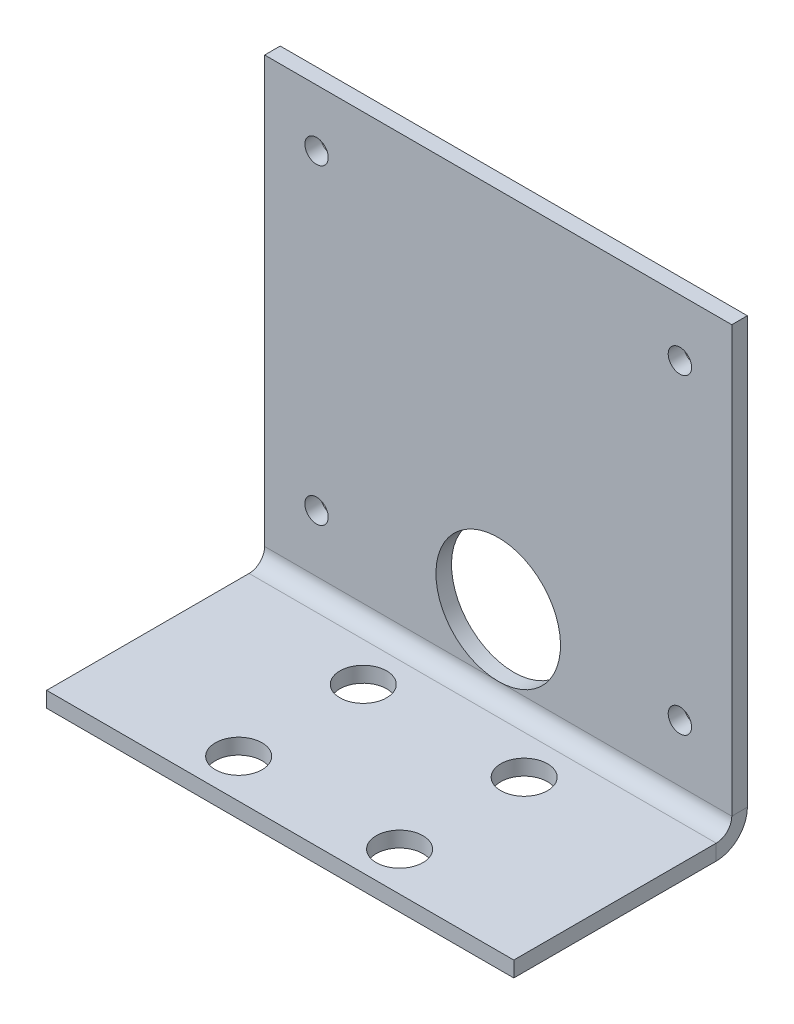
ISO-10303-21;
HEADER;
FILE_DESCRIPTION(('STEP AP214'),'2;1');
FILE_NAME('part.step','',(''),(''),'','','');
FILE_SCHEMA(('AUTOMOTIVE_DESIGN { 1 0 10303 214 1 1 1 1 }'));
ENDSEC;
DATA;
#1=APPLICATION_CONTEXT('core data for automotive mechanical design processes');
#2=APPLICATION_PROTOCOL_DEFINITION('international standard','automotive_design',2000,#1);
#3=PRODUCT_CONTEXT('',#1,'mechanical');
#4=PRODUCT('Part','Part','',(#3));
#5=PRODUCT_RELATED_PRODUCT_CATEGORY('part','',(#4));
#6=PRODUCT_DEFINITION_FORMATION('','',#4);
#7=PRODUCT_DEFINITION_CONTEXT('part definition',#1,'design');
#8=PRODUCT_DEFINITION('design','',#6,#7);
#9=PRODUCT_DEFINITION_SHAPE('','',#8);
#10=(LENGTH_UNIT() NAMED_UNIT(*) SI_UNIT(.MILLI.,.METRE.));
#11=(NAMED_UNIT(*) PLANE_ANGLE_UNIT() SI_UNIT($,.RADIAN.));
#12=(NAMED_UNIT(*) SI_UNIT($,.STERADIAN.) SOLID_ANGLE_UNIT());
#13=UNCERTAINTY_MEASURE_WITH_UNIT(LENGTH_MEASURE(1.E-05),#10,'distance_accuracy_value','');
#14=(GEOMETRIC_REPRESENTATION_CONTEXT(3) GLOBAL_UNCERTAINTY_ASSIGNED_CONTEXT((#13)) GLOBAL_UNIT_ASSIGNED_CONTEXT((#10,
#11,#12)) REPRESENTATION_CONTEXT('',''));
#15=CARTESIAN_POINT('',(0.,0.,0.));
#16=DIRECTION('',(0.,0.,1.));
#17=DIRECTION('',(1.,0.,0.));
#18=AXIS2_PLACEMENT_3D('',#15,#16,#17);
#19=CARTESIAN_POINT('',(-90.,-3.,-100.));
#20=DIRECTION('',(-1.,0.,0.));
#21=DIRECTION('',(0.,0.,1.));
#22=AXIS2_PLACEMENT_3D('',#19,#20,#21);
#23=PLANE('',#22);
#24=DIRECTION('',(0.,1.,0.));
#25=VECTOR('',#24,1.);
#26=CARTESIAN_POINT('',(-90.,-10.,-58.));
#27=LINE('',#26,#25);
#28=CARTESIAN_POINT('',(-90.,-3.,-58.));
#29=VERTEX_POINT('',#28);
#30=CARTESIAN_POINT('',(-90.,0.,-58.));
#31=VERTEX_POINT('',#30);
#32=EDGE_CURVE('E224',#29,#31,#27,.T.);
#33=ORIENTED_EDGE('',*,*,#32,.T.);
#34=DIRECTION('',(0.,0.,1.));
#35=VECTOR('',#34,1.);
#36=CARTESIAN_POINT('',(-90.,0.,-100.));
#37=LINE('',#36,#35);
#38=CARTESIAN_POINT('',(-90.,0.,-97.));
#39=VERTEX_POINT('',#38);
#40=EDGE_CURVE('E164',#39,#31,#37,.T.);
#41=ORIENTED_EDGE('',*,*,#40,.F.);
#42=DIRECTION('',(0.,-1.,0.));
#43=VECTOR('',#42,1.);
#44=CARTESIAN_POINT('',(-90.,0.,-97.));
#45=LINE('',#44,#43);
#46=CARTESIAN_POINT('',(-90.,-3.00000000000003,-97.));
#47=VERTEX_POINT('',#46);
#48=EDGE_CURVE('E149',#39,#47,#45,.T.);
#49=ORIENTED_EDGE('',*,*,#48,.T.);
#50=DIRECTION('',(0.,0.,1.));
#51=VECTOR('',#50,1.);
#52=CARTESIAN_POINT('',(-90.,-3.,-100.));
#53=LINE('',#52,#51);
#54=EDGE_CURVE('E48',#47,#29,#53,.T.);
#55=ORIENTED_EDGE('',*,*,#54,.T.);
#56=EDGE_LOOP('',(#33,#41,#49,#55));
#57=FACE_BOUND('',#56,.T.);
#58=ADVANCED_FACE('F40',(#57),#23,.T.);
#59=CARTESIAN_POINT('',(0.,-3.,0.));
#60=DIRECTION('',(0.,1.,0.));
#61=DIRECTION('',(0.,0.,1.));
#62=AXIS2_PLACEMENT_3D('',#59,#60,#61);
#63=PLANE('',#62);
#64=CARTESIAN_POINT('',(-29.4999999999998,-3.,-89.5000000000001));
#65=DIRECTION('',(0.,-1.,0.));
#66=DIRECTION('',(0.,0.,-1.));
#67=AXIS2_PLACEMENT_3D('',#64,#65,#66);
#68=CIRCLE('',#67,4.5);
#69=CARTESIAN_POINT('',(-29.4999999999998,-3.,-94.0000000000001));
#70=VERTEX_POINT('',#69);
#71=EDGE_CURVE('E240',#70,#70,#68,.T.);
#72=ORIENTED_EDGE('',*,*,#71,.F.);
#73=EDGE_LOOP('',(#72));
#74=FACE_BOUND('',#73,.T.);
#75=CARTESIAN_POINT('',(-29.4999999999999,-3.,-65.5000000000001));
#76=DIRECTION('',(0.,-1.,0.));
#77=DIRECTION('',(0.,0.,-1.));
#78=AXIS2_PLACEMENT_3D('',#75,#76,#77);
#79=CIRCLE('',#78,4.5);
#80=CARTESIAN_POINT('',(-29.4999999999999,-3.,-70.0000000000001));
#81=VERTEX_POINT('',#80);
#82=EDGE_CURVE('E244',#81,#81,#79,.T.);
#83=ORIENTED_EDGE('',*,*,#82,.F.);
#84=EDGE_LOOP('',(#83));
#85=FACE_BOUND('',#84,.T.);
#86=CARTESIAN_POINT('',(-60.4999999999999,-3.,-65.5));
#87=DIRECTION('',(0.,-1.,0.));
#88=DIRECTION('',(0.,0.,-1.));
#89=AXIS2_PLACEMENT_3D('',#86,#87,#88);
#90=CIRCLE('',#89,4.5);
#91=CARTESIAN_POINT('',(-60.4999999999999,-3.,-70.));
#92=VERTEX_POINT('',#91);
#93=EDGE_CURVE('E241',#92,#92,#90,.T.);
#94=ORIENTED_EDGE('',*,*,#93,.F.);
#95=EDGE_LOOP('',(#94));
#96=FACE_BOUND('',#95,.T.);
#97=CARTESIAN_POINT('',(-60.4999999999999,-3.,-89.5));
#98=DIRECTION('',(0.,-1.,0.));
#99=DIRECTION('',(0.,0.,-1.));
#100=AXIS2_PLACEMENT_3D('',#97,#98,#99);
#101=CIRCLE('',#100,4.5);
#102=CARTESIAN_POINT('',(-60.4999999999999,-3.,-94.));
#103=VERTEX_POINT('',#102);
#104=EDGE_CURVE('E177',#103,#103,#101,.T.);
#105=ORIENTED_EDGE('',*,*,#104,.F.);
#106=EDGE_LOOP('',(#105));
#107=FACE_BOUND('',#106,.T.);
#108=DIRECTION('',(0.,0.,-1.));
#109=VECTOR('',#108,1.);
#110=CARTESIAN_POINT('',(0.,-3.,-100.));
#111=LINE('',#110,#109);
#112=CARTESIAN_POINT('',(0.,-3.,-58.));
#113=VERTEX_POINT('',#112);
#114=CARTESIAN_POINT('',(0.,-3.,-97.));
#115=VERTEX_POINT('',#114);
#116=EDGE_CURVE('E11',#113,#115,#111,.T.);
#117=ORIENTED_EDGE('',*,*,#116,.F.);
#118=DIRECTION('',(-1.,0.,0.));
#119=VECTOR('',#118,1.);
#120=CARTESIAN_POINT('',(0.,-3.,-58.));
#121=LINE('',#120,#119);
#122=EDGE_CURVE('E64',#113,#29,#121,.T.);
#123=ORIENTED_EDGE('',*,*,#122,.T.);
#124=ORIENTED_EDGE('',*,*,#54,.F.);
#125=DIRECTION('',(-1.,0.,0.));
#126=VECTOR('',#125,1.);
#127=CARTESIAN_POINT('',(-90.,-3.00000000000003,-97.));
#128=LINE('',#127,#126);
#129=EDGE_CURVE('E142',#47,#115,#128,.F.);
#130=ORIENTED_EDGE('',*,*,#129,.T.);
#131=EDGE_LOOP('',(#117,#123,#124,#130));
#132=FACE_BOUND('',#131,.T.);
#133=ADVANCED_FACE('F230',(#74,#85,#96,#107,#132),#63,.F.);
#134=CARTESIAN_POINT('',(0.,0.,0.));
#135=DIRECTION('',(0.,1.,0.));
#136=DIRECTION('',(0.,0.,1.));
#137=AXIS2_PLACEMENT_3D('',#134,#135,#136);
#138=PLANE('',#137);
#139=DIRECTION('',(-1.,0.,0.));
#140=VECTOR('',#139,1.);
#141=CARTESIAN_POINT('',(-90.,0.,-58.));
#142=LINE('',#141,#140);
#143=CARTESIAN_POINT('',(0.,0.,-58.));
#144=VERTEX_POINT('',#143);
#145=EDGE_CURVE('E454',#144,#31,#142,.T.);
#146=ORIENTED_EDGE('',*,*,#145,.F.);
#147=DIRECTION('',(0.,0.,-1.));
#148=VECTOR('',#147,1.);
#149=CARTESIAN_POINT('',(0.,0.,-100.));
#150=LINE('',#149,#148);
#151=CARTESIAN_POINT('',(0.,0.,-97.));
#152=VERTEX_POINT('',#151);
#153=EDGE_CURVE('E168',#144,#152,#150,.T.);
#154=ORIENTED_EDGE('',*,*,#153,.T.);
#155=DIRECTION('',(-1.,0.,0.));
#156=VECTOR('',#155,1.);
#157=CARTESIAN_POINT('',(-90.,0.,-97.));
#158=LINE('',#157,#156);
#159=EDGE_CURVE('E155',#39,#152,#158,.F.);
#160=ORIENTED_EDGE('',*,*,#159,.F.);
#161=ORIENTED_EDGE('',*,*,#40,.T.);
#162=EDGE_LOOP('',(#146,#154,#160,#161));
#163=FACE_BOUND('',#162,.T.);
#164=CARTESIAN_POINT('',(-29.4999999999998,0.,-89.5000000000001));
#165=DIRECTION('',(0.,1.,0.));
#166=DIRECTION('',(0.,0.,1.));
#167=AXIS2_PLACEMENT_3D('',#164,#165,#166);
#168=CIRCLE('',#167,4.5);
#169=CARTESIAN_POINT('',(-29.4999999999998,0.,-85.0000000000001));
#170=VERTEX_POINT('',#169);
#171=EDGE_CURVE('E43',#170,#170,#168,.T.);
#172=ORIENTED_EDGE('',*,*,#171,.F.);
#173=EDGE_LOOP('',(#172));
#174=FACE_BOUND('',#173,.T.);
#175=CARTESIAN_POINT('',(-29.4999999999999,0.,-65.5000000000001));
#176=DIRECTION('',(0.,1.,0.));
#177=DIRECTION('',(0.,0.,1.));
#178=AXIS2_PLACEMENT_3D('',#175,#176,#177);
#179=CIRCLE('',#178,4.5);
#180=CARTESIAN_POINT('',(-29.4999999999999,0.,-61.0000000000001));
#181=VERTEX_POINT('',#180);
#182=EDGE_CURVE('E179',#181,#181,#179,.T.);
#183=ORIENTED_EDGE('',*,*,#182,.F.);
#184=EDGE_LOOP('',(#183));
#185=FACE_BOUND('',#184,.T.);
#186=CARTESIAN_POINT('',(-60.4999999999999,0.,-65.5));
#187=DIRECTION('',(0.,1.,0.));
#188=DIRECTION('',(0.,0.,1.));
#189=AXIS2_PLACEMENT_3D('',#186,#187,#188);
#190=CIRCLE('',#189,4.5);
#191=CARTESIAN_POINT('',(-60.4999999999999,0.,-61.));
#192=VERTEX_POINT('',#191);
#193=EDGE_CURVE('E176',#192,#192,#190,.T.);
#194=ORIENTED_EDGE('',*,*,#193,.F.);
#195=EDGE_LOOP('',(#194));
#196=FACE_BOUND('',#195,.T.);
#197=CARTESIAN_POINT('',(-60.4999999999999,0.,-89.5));
#198=DIRECTION('',(0.,1.,0.));
#199=DIRECTION('',(0.,0.,1.));
#200=AXIS2_PLACEMENT_3D('',#197,#198,#199);
#201=CIRCLE('',#200,4.5);
#202=CARTESIAN_POINT('',(-60.4999999999999,0.,-85.));
#203=VERTEX_POINT('',#202);
#204=EDGE_CURVE('E173',#203,#203,#201,.T.);
#205=ORIENTED_EDGE('',*,*,#204,.F.);
#206=EDGE_LOOP('',(#205));
#207=FACE_BOUND('',#206,.T.);
#208=ADVANCED_FACE('F219',(#163,#174,#185,#196,#207),#138,.T.);
#209=CARTESIAN_POINT('',(0.,-3.,-100.));
#210=DIRECTION('',(1.,0.,0.));
#211=DIRECTION('',(0.,0.,-1.));
#212=AXIS2_PLACEMENT_3D('',#209,#210,#211);
#213=PLANE('',#212);
#214=DIRECTION('',(0.,1.,0.));
#215=VECTOR('',#214,1.);
#216=CARTESIAN_POINT('',(0.,-10.,-58.));
#217=LINE('',#216,#215);
#218=EDGE_CURVE('E235',#113,#144,#217,.T.);
#219=ORIENTED_EDGE('',*,*,#218,.F.);
#220=ORIENTED_EDGE('',*,*,#116,.T.);
#221=DIRECTION('',(0.,-1.,0.));
#222=VECTOR('',#221,1.);
#223=CARTESIAN_POINT('',(0.,0.,-97.));
#224=LINE('',#223,#222);
#225=EDGE_CURVE('E161',#152,#115,#224,.T.);
#226=ORIENTED_EDGE('',*,*,#225,.F.);
#227=ORIENTED_EDGE('',*,*,#153,.F.);
#228=EDGE_LOOP('',(#219,#220,#226,#227));
#229=FACE_BOUND('',#228,.T.);
#230=ADVANCED_FACE('F211',(#229),#213,.T.);
#231=CARTESIAN_POINT('',(0.,2.99999999999997,-97.));
#232=DIRECTION('',(1.,0.,0.));
#233=DIRECTION('',(0.,0.,-1.));
#234=AXIS2_PLACEMENT_3D('',#231,#232,#233);
#235=PLANE('',#234);
#236=DIRECTION('',(0.,0.,-1.));
#237=VECTOR('',#236,1.);
#238=CARTESIAN_POINT('',(0.,2.99999999999999,-100.));
#239=LINE('',#238,#237);
#240=CARTESIAN_POINT('',(0.,2.99999999999996,-100.));
#241=VERTEX_POINT('',#240);
#242=CARTESIAN_POINT('',(0.,2.99999999999995,-103.));
#243=VERTEX_POINT('',#242);
#244=EDGE_CURVE('E184',#241,#243,#239,.T.);
#245=ORIENTED_EDGE('',*,*,#244,.F.);
#246=CARTESIAN_POINT('',(0.,2.99999999999997,-97.));
#247=DIRECTION('',(-1.,0.,0.));
#248=DIRECTION('',(0.,0.,1.));
#249=AXIS2_PLACEMENT_3D('',#246,#247,#248);
#250=CIRCLE('',#249,3.);
#251=EDGE_CURVE('E152',#152,#241,#250,.F.);
#252=ORIENTED_EDGE('',*,*,#251,.F.);
#253=ORIENTED_EDGE('',*,*,#225,.T.);
#254=CARTESIAN_POINT('',(0.,2.99999999999997,-97.));
#255=DIRECTION('',(-1.,0.,0.));
#256=DIRECTION('',(0.,0.,1.));
#257=AXIS2_PLACEMENT_3D('',#254,#255,#256);
#258=CIRCLE('',#257,6.);
#259=EDGE_CURVE('E145',#115,#243,#258,.F.);
#260=ORIENTED_EDGE('',*,*,#259,.T.);
#261=EDGE_LOOP('',(#245,#252,#253,#260));
#262=FACE_BOUND('',#261,.T.);
#263=ADVANCED_FACE('F206',(#262),#235,.T.);
#264=CARTESIAN_POINT('',(-90.,2.99999999999997,-97.));
#265=DIRECTION('',(1.,0.,0.));
#266=DIRECTION('',(0.,0.,-1.));
#267=AXIS2_PLACEMENT_3D('',#264,#265,#266);
#268=PLANE('',#267);
#269=CARTESIAN_POINT('',(-90.,2.99999999999997,-97.));
#270=DIRECTION('',(-1.,0.,0.));
#271=DIRECTION('',(0.,0.,1.));
#272=AXIS2_PLACEMENT_3D('',#269,#270,#271);
#273=CIRCLE('',#272,3.);
#274=CARTESIAN_POINT('',(-90.,2.99999999999996,-100.));
#275=VERTEX_POINT('',#274);
#276=EDGE_CURVE('E158',#275,#39,#273,.T.);
#277=ORIENTED_EDGE('',*,*,#276,.F.);
#278=DIRECTION('',(0.,0.,-1.));
#279=VECTOR('',#278,1.);
#280=CARTESIAN_POINT('',(-90.,2.99999999999999,-100.));
#281=LINE('',#280,#279);
#282=CARTESIAN_POINT('',(-90.,3.00000000000001,-103.));
#283=VERTEX_POINT('',#282);
#284=EDGE_CURVE('E192',#275,#283,#281,.T.);
#285=ORIENTED_EDGE('',*,*,#284,.T.);
#286=CARTESIAN_POINT('',(-90.,2.99999999999997,-97.));
#287=DIRECTION('',(-1.,0.,0.));
#288=DIRECTION('',(0.,0.,1.));
#289=AXIS2_PLACEMENT_3D('',#286,#287,#288);
#290=CIRCLE('',#289,6.);
#291=EDGE_CURVE('E146',#283,#47,#290,.T.);
#292=ORIENTED_EDGE('',*,*,#291,.T.);
#293=ORIENTED_EDGE('',*,*,#48,.F.);
#294=EDGE_LOOP('',(#277,#285,#292,#293));
#295=FACE_BOUND('',#294,.T.);
#296=ADVANCED_FACE('F226',(#295),#268,.F.);
#297=CARTESIAN_POINT('',(-90.,2.99999999999997,-97.));
#298=DIRECTION('',(-1.,0.,0.));
#299=DIRECTION('',(0.,0.,-1.));
#300=AXIS2_PLACEMENT_3D('',#297,#298,#299);
#301=CYLINDRICAL_SURFACE('',#300,6.);
#302=ORIENTED_EDGE('',*,*,#129,.F.);
#303=ORIENTED_EDGE('',*,*,#291,.F.);
#304=DIRECTION('',(1.,0.,0.));
#305=VECTOR('',#304,1.);
#306=CARTESIAN_POINT('',(0.,3.00000000000001,-103.));
#307=LINE('',#306,#305);
#308=CARTESIAN_POINT('',(-44.9999999999999,3.00000000000001,-103.));
#309=VERTEX_POINT('',#308);
#310=EDGE_CURVE('E138',#283,#309,#307,.T.);
#311=ORIENTED_EDGE('',*,*,#310,.T.);
#312=EDGE_CURVE('E194',#309,#243,#307,.T.);
#313=ORIENTED_EDGE('',*,*,#312,.T.);
#314=ORIENTED_EDGE('',*,*,#259,.F.);
#315=EDGE_LOOP('',(#302,#303,#311,#313,#314));
#316=FACE_BOUND('',#315,.T.);
#317=ADVANCED_FACE('F203',(#316),#301,.T.);
#318=CARTESIAN_POINT('',(-90.,2.99999999999997,-97.));
#319=DIRECTION('',(-1.,0.,0.));
#320=DIRECTION('',(0.,0.,-1.));
#321=AXIS2_PLACEMENT_3D('',#318,#319,#320);
#322=CYLINDRICAL_SURFACE('',#321,3.);
#323=ORIENTED_EDGE('',*,*,#159,.T.);
#324=ORIENTED_EDGE('',*,*,#251,.T.);
#325=DIRECTION('',(-1.,0.,0.));
#326=VECTOR('',#325,1.);
#327=CARTESIAN_POINT('',(0.,2.99999999999999,-100.));
#328=LINE('',#327,#326);
#329=CARTESIAN_POINT('',(-44.9999999999999,2.99999999999999,-100.));
#330=VERTEX_POINT('',#329);
#331=EDGE_CURVE('E132',#241,#330,#328,.T.);
#332=ORIENTED_EDGE('',*,*,#331,.T.);
#333=EDGE_CURVE('E187',#330,#275,#328,.T.);
#334=ORIENTED_EDGE('',*,*,#333,.T.);
#335=ORIENTED_EDGE('',*,*,#276,.T.);
#336=EDGE_LOOP('',(#323,#324,#332,#334,#335));
#337=FACE_BOUND('',#336,.T.);
#338=ADVANCED_FACE('F214',(#337),#322,.F.);
#339=CARTESIAN_POINT('',(-90.,100.,-103.));
#340=DIRECTION('',(1.,0.,0.));
#341=DIRECTION('',(0.,1.,0.));
#342=AXIS2_PLACEMENT_3D('',#339,#340,#341);
#343=PLANE('',#342);
#344=DIRECTION('',(0.,1.,0.));
#345=VECTOR('',#344,1.);
#346=CARTESIAN_POINT('',(-90.,100.,-100.));
#347=LINE('',#346,#345);
#348=CARTESIAN_POINT('',(-90.,85.,-100.));
#349=VERTEX_POINT('',#348);
#350=EDGE_CURVE('E134',#275,#349,#347,.T.);
#351=ORIENTED_EDGE('',*,*,#350,.T.);
#352=DIRECTION('',(0.,0.,1.));
#353=VECTOR('',#352,1.);
#354=CARTESIAN_POINT('',(-90.,85.,-110.));
#355=LINE('',#354,#353);
#356=CARTESIAN_POINT('',(-90.,85.,-103.));
#357=VERTEX_POINT('',#356);
#358=EDGE_CURVE('E56',#357,#349,#355,.T.);
#359=ORIENTED_EDGE('',*,*,#358,.F.);
#360=DIRECTION('',(0.,1.,0.));
#361=VECTOR('',#360,1.);
#362=CARTESIAN_POINT('',(-90.,100.,-103.));
#363=LINE('',#362,#361);
#364=EDGE_CURVE('E133',#283,#357,#363,.T.);
#365=ORIENTED_EDGE('',*,*,#364,.F.);
#366=ORIENTED_EDGE('',*,*,#284,.F.);
#367=EDGE_LOOP('',(#351,#359,#365,#366));
#368=FACE_BOUND('',#367,.T.);
#369=ADVANCED_FACE('F252',(#368),#343,.F.);
#370=CARTESIAN_POINT('',(0.,0.,-103.));
#371=DIRECTION('',(-1.,0.,0.));
#372=DIRECTION('',(0.,-1.,0.));
#373=AXIS2_PLACEMENT_3D('',#370,#371,#372);
#374=PLANE('',#373);
#375=DIRECTION('',(0.,-1.,0.));
#376=VECTOR('',#375,1.);
#377=CARTESIAN_POINT('',(0.,0.,-103.));
#378=LINE('',#377,#376);
#379=CARTESIAN_POINT('',(0.,85.,-103.));
#380=VERTEX_POINT('',#379);
#381=EDGE_CURVE('E125',#380,#243,#378,.T.);
#382=ORIENTED_EDGE('',*,*,#381,.F.);
#383=DIRECTION('',(0.,0.,1.));
#384=VECTOR('',#383,1.);
#385=CARTESIAN_POINT('',(0.,85.,-110.));
#386=LINE('',#385,#384);
#387=CARTESIAN_POINT('',(0.,85.,-100.));
#388=VERTEX_POINT('',#387);
#389=EDGE_CURVE('E111',#380,#388,#386,.T.);
#390=ORIENTED_EDGE('',*,*,#389,.T.);
#391=DIRECTION('',(0.,-1.,0.));
#392=VECTOR('',#391,1.);
#393=CARTESIAN_POINT('',(0.,0.,-100.));
#394=LINE('',#393,#392);
#395=EDGE_CURVE('E123',#388,#241,#394,.T.);
#396=ORIENTED_EDGE('',*,*,#395,.T.);
#397=ORIENTED_EDGE('',*,*,#244,.T.);
#398=EDGE_LOOP('',(#382,#390,#396,#397));
#399=FACE_BOUND('',#398,.T.);
#400=ADVANCED_FACE('F121',(#399),#374,.F.);
#401=CARTESIAN_POINT('',(0.,-3.57419139211891E-13,-103.));
#402=DIRECTION('',(0.,0.,1.));
#403=DIRECTION('',(0.,-1.,0.));
#404=AXIS2_PLACEMENT_3D('',#401,#402,#403);
#405=PLANE('',#404);
#406=CARTESIAN_POINT('',(-80.,74.,-103.));
#407=DIRECTION('',(0.,0.,1.));
#408=DIRECTION('',(0.,-1.,0.));
#409=AXIS2_PLACEMENT_3D('',#406,#407,#408);
#410=CIRCLE('',#409,2.25);
#411=CARTESIAN_POINT('',(-80.,71.75,-103.));
#412=VERTEX_POINT('',#411);
#413=EDGE_CURVE('E431',#412,#412,#410,.T.);
#414=ORIENTED_EDGE('',*,*,#413,.T.);
#415=EDGE_LOOP('',(#414));
#416=FACE_BOUND('',#415,.T.);
#417=CARTESIAN_POINT('',(-9.99999999999995,14.,-103.));
#418=DIRECTION('',(0.,0.,1.));
#419=DIRECTION('',(0.,-1.,0.));
#420=AXIS2_PLACEMENT_3D('',#417,#418,#419);
#421=CIRCLE('',#420,2.25);
#422=CARTESIAN_POINT('',(-9.99999999999995,11.75,-103.));
#423=VERTEX_POINT('',#422);
#424=EDGE_CURVE('E435',#423,#423,#421,.T.);
#425=ORIENTED_EDGE('',*,*,#424,.T.);
#426=EDGE_LOOP('',(#425));
#427=FACE_BOUND('',#426,.T.);
#428=CARTESIAN_POINT('',(-80.,14.,-103.));
#429=DIRECTION('',(0.,0.,1.));
#430=DIRECTION('',(0.,-1.,0.));
#431=AXIS2_PLACEMENT_3D('',#428,#429,#430);
#432=CIRCLE('',#431,2.25);
#433=CARTESIAN_POINT('',(-80.,11.75,-103.));
#434=VERTEX_POINT('',#433);
#435=EDGE_CURVE('E444',#434,#434,#432,.T.);
#436=ORIENTED_EDGE('',*,*,#435,.T.);
#437=EDGE_LOOP('',(#436));
#438=FACE_BOUND('',#437,.T.);
#439=CARTESIAN_POINT('',(-9.99999999999997,74.,-103.));
#440=DIRECTION('',(0.,0.,1.));
#441=DIRECTION('',(0.,-1.,0.));
#442=AXIS2_PLACEMENT_3D('',#439,#440,#441);
#443=CIRCLE('',#442,2.25);
#444=CARTESIAN_POINT('',(-9.99999999999997,71.75,-103.));
#445=VERTEX_POINT('',#444);
#446=EDGE_CURVE('E117',#445,#445,#443,.T.);
#447=ORIENTED_EDGE('',*,*,#446,.T.);
#448=EDGE_LOOP('',(#447));
#449=FACE_BOUND('',#448,.T.);
#450=ORIENTED_EDGE('',*,*,#364,.T.);
#451=DIRECTION('',(1.,0.,0.));
#452=VECTOR('',#451,1.);
#453=CARTESIAN_POINT('',(0.,85.,-103.));
#454=LINE('',#453,#452);
#455=EDGE_CURVE('E126',#357,#380,#454,.T.);
#456=ORIENTED_EDGE('',*,*,#455,.T.);
#457=ORIENTED_EDGE('',*,*,#381,.T.);
#458=ORIENTED_EDGE('',*,*,#312,.F.);
#459=CARTESIAN_POINT('',(-44.9999999999999,15.0000000000001,-103.));
#460=DIRECTION('',(0.,0.,1.));
#461=DIRECTION('',(0.,-1.,0.));
#462=AXIS2_PLACEMENT_3D('',#459,#460,#461);
#463=CIRCLE('',#462,12.);
#464=EDGE_CURVE('E233',#309,#309,#463,.T.);
#465=ORIENTED_EDGE('',*,*,#464,.T.);
#466=ORIENTED_EDGE('',*,*,#310,.F.);
#467=EDGE_LOOP('',(#450,#456,#457,#458,#465,#466));
#468=FACE_BOUND('',#467,.T.);
#469=ADVANCED_FACE('F198',(#416,#427,#438,#449,#468),#405,.F.);
#470=CARTESIAN_POINT('',(0.,-3.46944695195361E-13,-100.));
#471=DIRECTION('',(0.,0.,1.));
#472=DIRECTION('',(0.,-1.,0.));
#473=AXIS2_PLACEMENT_3D('',#470,#471,#472);
#474=PLANE('',#473);
#475=CARTESIAN_POINT('',(-80.,74.,-100.));
#476=DIRECTION('',(0.,0.,1.));
#477=DIRECTION('',(1.,0.,0.));
#478=AXIS2_PLACEMENT_3D('',#475,#476,#477);
#479=CIRCLE('',#478,2.25);
#480=CARTESIAN_POINT('',(-77.75,74.,-100.));
#481=VERTEX_POINT('',#480);
#482=EDGE_CURVE('E428',#481,#481,#479,.T.);
#483=ORIENTED_EDGE('',*,*,#482,.F.);
#484=EDGE_LOOP('',(#483));
#485=FACE_BOUND('',#484,.T.);
#486=CARTESIAN_POINT('',(-9.99999999999995,14.,-100.));
#487=DIRECTION('',(0.,0.,1.));
#488=DIRECTION('',(1.,0.,0.));
#489=AXIS2_PLACEMENT_3D('',#486,#487,#488);
#490=CIRCLE('',#489,2.25);
#491=CARTESIAN_POINT('',(-7.74999999999996,14.,-100.));
#492=VERTEX_POINT('',#491);
#493=EDGE_CURVE('E432',#492,#492,#490,.T.);
#494=ORIENTED_EDGE('',*,*,#493,.F.);
#495=EDGE_LOOP('',(#494));
#496=FACE_BOUND('',#495,.T.);
#497=CARTESIAN_POINT('',(-80.,14.,-100.));
#498=DIRECTION('',(0.,0.,1.));
#499=DIRECTION('',(1.,0.,0.));
#500=AXIS2_PLACEMENT_3D('',#497,#498,#499);
#501=CIRCLE('',#500,2.25);
#502=CARTESIAN_POINT('',(-77.75,14.,-100.));
#503=VERTEX_POINT('',#502);
#504=EDGE_CURVE('E441',#503,#503,#501,.T.);
#505=ORIENTED_EDGE('',*,*,#504,.F.);
#506=EDGE_LOOP('',(#505));
#507=FACE_BOUND('',#506,.T.);
#508=CARTESIAN_POINT('',(-9.99999999999997,74.,-100.));
#509=DIRECTION('',(0.,0.,1.));
#510=DIRECTION('',(1.,0.,0.));
#511=AXIS2_PLACEMENT_3D('',#508,#509,#510);
#512=CIRCLE('',#511,2.25);
#513=CARTESIAN_POINT('',(-7.74999999999997,74.,-100.));
#514=VERTEX_POINT('',#513);
#515=EDGE_CURVE('E447',#514,#514,#512,.T.);
#516=ORIENTED_EDGE('',*,*,#515,.F.);
#517=EDGE_LOOP('',(#516));
#518=FACE_BOUND('',#517,.T.);
#519=DIRECTION('',(1.,0.,0.));
#520=VECTOR('',#519,1.);
#521=CARTESIAN_POINT('',(-90.,85.,-100.));
#522=LINE('',#521,#520);
#523=EDGE_CURVE('E108',#349,#388,#522,.T.);
#524=ORIENTED_EDGE('',*,*,#523,.F.);
#525=ORIENTED_EDGE('',*,*,#350,.F.);
#526=ORIENTED_EDGE('',*,*,#333,.F.);
#527=CARTESIAN_POINT('',(-44.9999999999999,15.0000000000001,-100.));
#528=DIRECTION('',(0.,0.,1.));
#529=DIRECTION('',(1.,0.,0.));
#530=AXIS2_PLACEMENT_3D('',#527,#528,#529);
#531=CIRCLE('',#530,12.);
#532=EDGE_CURVE('E231',#330,#330,#531,.T.);
#533=ORIENTED_EDGE('',*,*,#532,.F.);
#534=ORIENTED_EDGE('',*,*,#331,.F.);
#535=ORIENTED_EDGE('',*,*,#395,.F.);
#536=EDGE_LOOP('',(#524,#525,#526,#533,#534,#535));
#537=FACE_BOUND('',#536,.T.);
#538=ADVANCED_FACE('F129',(#485,#496,#507,#518,#537),#474,.T.);
#539=CARTESIAN_POINT('',(-60.4999999999999,7.,-89.5));
#540=DIRECTION('',(0.,-1.,0.));
#541=DIRECTION('',(0.,0.,-1.));
#542=AXIS2_PLACEMENT_3D('',#539,#540,#541);
#543=CYLINDRICAL_SURFACE('',#542,4.5);
#544=ORIENTED_EDGE('',*,*,#204,.T.);
#545=EDGE_LOOP('',(#544));
#546=FACE_BOUND('',#545,.T.);
#547=ORIENTED_EDGE('',*,*,#104,.T.);
#548=EDGE_LOOP('',(#547));
#549=FACE_BOUND('',#548,.T.);
#550=ADVANCED_FACE('F302',(#546,#549),#543,.F.);
#551=CARTESIAN_POINT('',(-60.4999999999999,7.,-65.5));
#552=DIRECTION('',(0.,-1.,0.));
#553=DIRECTION('',(0.,0.,-1.));
#554=AXIS2_PLACEMENT_3D('',#551,#552,#553);
#555=CYLINDRICAL_SURFACE('',#554,4.5);
#556=ORIENTED_EDGE('',*,*,#193,.T.);
#557=EDGE_LOOP('',(#556));
#558=FACE_BOUND('',#557,.T.);
#559=ORIENTED_EDGE('',*,*,#93,.T.);
#560=EDGE_LOOP('',(#559));
#561=FACE_BOUND('',#560,.T.);
#562=ADVANCED_FACE('F308',(#558,#561),#555,.F.);
#563=CARTESIAN_POINT('',(-29.4999999999999,7.,-65.5000000000001));
#564=DIRECTION('',(0.,-1.,0.));
#565=DIRECTION('',(0.,0.,-1.));
#566=AXIS2_PLACEMENT_3D('',#563,#564,#565);
#567=CYLINDRICAL_SURFACE('',#566,4.5);
#568=ORIENTED_EDGE('',*,*,#182,.T.);
#569=EDGE_LOOP('',(#568));
#570=FACE_BOUND('',#569,.T.);
#571=ORIENTED_EDGE('',*,*,#82,.T.);
#572=EDGE_LOOP('',(#571));
#573=FACE_BOUND('',#572,.T.);
#574=ADVANCED_FACE('F266',(#570,#573),#567,.F.);
#575=CARTESIAN_POINT('',(-29.4999999999998,7.,-89.5000000000001));
#576=DIRECTION('',(0.,-1.,0.));
#577=DIRECTION('',(0.,0.,-1.));
#578=AXIS2_PLACEMENT_3D('',#575,#576,#577);
#579=CYLINDRICAL_SURFACE('',#578,4.5);
#580=ORIENTED_EDGE('',*,*,#171,.T.);
#581=EDGE_LOOP('',(#580));
#582=FACE_BOUND('',#581,.T.);
#583=ORIENTED_EDGE('',*,*,#71,.T.);
#584=EDGE_LOOP('',(#583));
#585=FACE_BOUND('',#584,.T.);
#586=ADVANCED_FACE('F258',(#582,#585),#579,.F.);
#587=CARTESIAN_POINT('',(-44.9999999999999,15.0000000000001,-110.));
#588=DIRECTION('',(0.,0.,1.));
#589=DIRECTION('',(1.,0.,0.));
#590=AXIS2_PLACEMENT_3D('',#587,#588,#589);
#591=CYLINDRICAL_SURFACE('',#590,12.);
#592=ORIENTED_EDGE('',*,*,#532,.T.);
#593=EDGE_LOOP('',(#592));
#594=FACE_BOUND('',#593,.T.);
#595=ORIENTED_EDGE('',*,*,#464,.F.);
#596=EDGE_LOOP('',(#595));
#597=FACE_BOUND('',#596,.T.);
#598=ADVANCED_FACE('F255',(#594,#597),#591,.F.);
#599=CARTESIAN_POINT('',(-90.,-10.,-58.));
#600=DIRECTION('',(0.,0.,-1.));
#601=DIRECTION('',(-1.,0.,0.));
#602=AXIS2_PLACEMENT_3D('',#599,#600,#601);
#603=PLANE('',#602);
#604=ORIENTED_EDGE('',*,*,#218,.T.);
#605=ORIENTED_EDGE('',*,*,#145,.T.);
#606=ORIENTED_EDGE('',*,*,#32,.F.);
#607=ORIENTED_EDGE('',*,*,#122,.F.);
#608=EDGE_LOOP('',(#604,#605,#606,#607));
#609=FACE_BOUND('',#608,.T.);
#610=ADVANCED_FACE('F257',(#609),#603,.F.);
#611=CARTESIAN_POINT('',(-90.,85.,-110.));
#612=DIRECTION('',(0.,-1.,0.));
#613=DIRECTION('',(0.,0.,-1.));
#614=AXIS2_PLACEMENT_3D('',#611,#612,#613);
#615=PLANE('',#614);
#616=ORIENTED_EDGE('',*,*,#358,.T.);
#617=ORIENTED_EDGE('',*,*,#523,.T.);
#618=ORIENTED_EDGE('',*,*,#389,.F.);
#619=ORIENTED_EDGE('',*,*,#455,.F.);
#620=EDGE_LOOP('',(#616,#617,#618,#619));
#621=FACE_BOUND('',#620,.T.);
#622=ADVANCED_FACE('F110',(#621),#615,.F.);
#623=CARTESIAN_POINT('',(-9.99999999999997,74.,-100.));
#624=DIRECTION('',(0.,0.,1.));
#625=DIRECTION('',(1.,0.,0.));
#626=AXIS2_PLACEMENT_3D('',#623,#624,#625);
#627=CYLINDRICAL_SURFACE('',#626,2.25);
#628=ORIENTED_EDGE('',*,*,#515,.T.);
#629=EDGE_LOOP('',(#628));
#630=FACE_BOUND('',#629,.T.);
#631=ORIENTED_EDGE('',*,*,#446,.F.);
#632=EDGE_LOOP('',(#631));
#633=FACE_BOUND('',#632,.T.);
#634=ADVANCED_FACE('F372',(#630,#633),#627,.F.);
#635=CARTESIAN_POINT('',(-80.,14.,-100.));
#636=DIRECTION('',(0.,0.,1.));
#637=DIRECTION('',(1.,0.,0.));
#638=AXIS2_PLACEMENT_3D('',#635,#636,#637);
#639=CYLINDRICAL_SURFACE('',#638,2.25);
#640=ORIENTED_EDGE('',*,*,#504,.T.);
#641=EDGE_LOOP('',(#640));
#642=FACE_BOUND('',#641,.T.);
#643=ORIENTED_EDGE('',*,*,#435,.F.);
#644=EDGE_LOOP('',(#643));
#645=FACE_BOUND('',#644,.T.);
#646=ADVANCED_FACE('F383',(#642,#645),#639,.F.);
#647=CARTESIAN_POINT('',(-9.99999999999995,14.,-100.));
#648=DIRECTION('',(0.,0.,1.));
#649=DIRECTION('',(1.,0.,0.));
#650=AXIS2_PLACEMENT_3D('',#647,#648,#649);
#651=CYLINDRICAL_SURFACE('',#650,2.25);
#652=ORIENTED_EDGE('',*,*,#493,.T.);
#653=EDGE_LOOP('',(#652));
#654=FACE_BOUND('',#653,.T.);
#655=ORIENTED_EDGE('',*,*,#424,.F.);
#656=EDGE_LOOP('',(#655));
#657=FACE_BOUND('',#656,.T.);
#658=ADVANCED_FACE('F394',(#654,#657),#651,.F.);
#659=CARTESIAN_POINT('',(-80.,74.,-100.));
#660=DIRECTION('',(0.,0.,1.));
#661=DIRECTION('',(1.,0.,0.));
#662=AXIS2_PLACEMENT_3D('',#659,#660,#661);
#663=CYLINDRICAL_SURFACE('',#662,2.25);
#664=ORIENTED_EDGE('',*,*,#482,.T.);
#665=EDGE_LOOP('',(#664));
#666=FACE_BOUND('',#665,.T.);
#667=ORIENTED_EDGE('',*,*,#413,.F.);
#668=EDGE_LOOP('',(#667));
#669=FACE_BOUND('',#668,.T.);
#670=ADVANCED_FACE('F405',(#666,#669),#663,.F.);
#671=CLOSED_SHELL('',(#58,#133,#208,#230,#263,#296,#317,#338,#369,#400,#469,#538,#550,#562,#574,
#586,#598,#610,#622,#634,#646,#658,#670));
#672=MANIFOLD_SOLID_BREP('B2',#671);
#673=ADVANCED_BREP_SHAPE_REPRESENTATION('',(#18,#672),#14);
#674=SHAPE_DEFINITION_REPRESENTATION(#9,#673);
ENDSEC;
END-ISO-10303-21;
